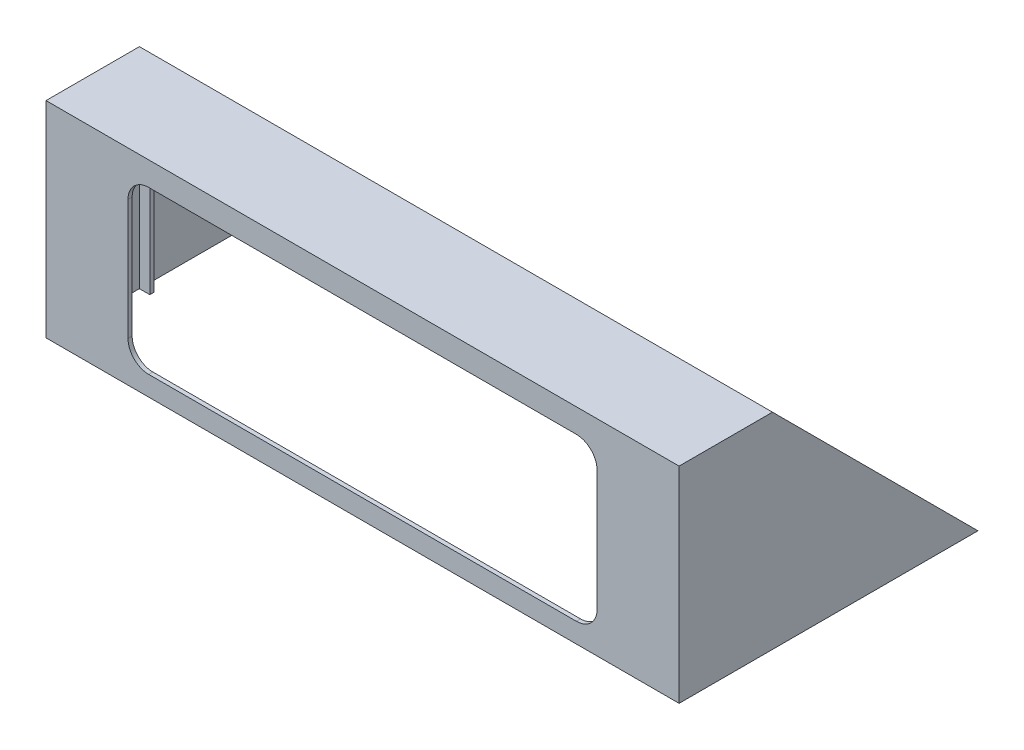
ISO-10303-21;
HEADER;
FILE_DESCRIPTION(('STEP AP214'),'2;1');
FILE_NAME('part.step','',(''),(''),'','','');
FILE_SCHEMA(('AUTOMOTIVE_DESIGN { 1 0 10303 214 1 1 1 1 }'));
ENDSEC;
DATA;
#1=APPLICATION_CONTEXT('core data for automotive mechanical design processes');
#2=APPLICATION_PROTOCOL_DEFINITION('international standard','automotive_design',2000,#1);
#3=PRODUCT_CONTEXT('',#1,'mechanical');
#4=PRODUCT('Part','Part','',(#3));
#5=PRODUCT_RELATED_PRODUCT_CATEGORY('part','',(#4));
#6=PRODUCT_DEFINITION_FORMATION('','',#4);
#7=PRODUCT_DEFINITION_CONTEXT('part definition',#1,'design');
#8=PRODUCT_DEFINITION('design','',#6,#7);
#9=PRODUCT_DEFINITION_SHAPE('','',#8);
#10=(LENGTH_UNIT() NAMED_UNIT(*) SI_UNIT(.MILLI.,.METRE.));
#11=(NAMED_UNIT(*) PLANE_ANGLE_UNIT() SI_UNIT($,.RADIAN.));
#12=(NAMED_UNIT(*) SI_UNIT($,.STERADIAN.) SOLID_ANGLE_UNIT());
#13=UNCERTAINTY_MEASURE_WITH_UNIT(LENGTH_MEASURE(1.E-05),#10,'distance_accuracy_value','');
#14=(GEOMETRIC_REPRESENTATION_CONTEXT(3) GLOBAL_UNCERTAINTY_ASSIGNED_CONTEXT((#13)) GLOBAL_UNIT_ASSIGNED_CONTEXT((#10,
#11,#12)) REPRESENTATION_CONTEXT('',''));
#15=CARTESIAN_POINT('',(0.,0.,0.));
#16=DIRECTION('',(0.,0.,1.));
#17=DIRECTION('',(1.,0.,0.));
#18=AXIS2_PLACEMENT_3D('',#15,#16,#17);
#19=CARTESIAN_POINT('',(0.,0.,-10.25));
#20=DIRECTION('',(0.,0.,1.));
#21=DIRECTION('',(1.,0.,0.));
#22=AXIS2_PLACEMENT_3D('',#19,#20,#21);
#23=PLANE('',#22);
#24=DIRECTION('',(0.,1.,0.));
#25=VECTOR('',#24,1.);
#26=CARTESIAN_POINT('',(-72.75,-24.25,-10.25));
#27=LINE('',#26,#25);
#28=CARTESIAN_POINT('',(-72.75,-24.25,-10.25));
#29=VERTEX_POINT('',#28);
#30=CARTESIAN_POINT('',(-72.75,24.25,-10.25));
#31=VERTEX_POINT('',#30);
#32=EDGE_CURVE('E375',#29,#31,#27,.T.);
#33=ORIENTED_EDGE('',*,*,#32,.T.);
#34=DIRECTION('',(-1.,0.,0.));
#35=VECTOR('',#34,1.);
#36=CARTESIAN_POINT('',(75.25,24.25,-10.25));
#37=LINE('',#36,#35);
#38=CARTESIAN_POINT('',(-75.25,24.25,-10.25));
#39=VERTEX_POINT('',#38);
#40=EDGE_CURVE('E417',#31,#39,#37,.T.);
#41=ORIENTED_EDGE('',*,*,#40,.T.);
#42=DIRECTION('',(0.,-1.,0.));
#43=VECTOR('',#42,1.);
#44=CARTESIAN_POINT('',(-75.25,-24.25,-10.25));
#45=LINE('',#44,#43);
#46=CARTESIAN_POINT('',(-75.25,-24.25,-10.25));
#47=VERTEX_POINT('',#46);
#48=EDGE_CURVE('E390',#39,#47,#45,.T.);
#49=ORIENTED_EDGE('',*,*,#48,.T.);
#50=DIRECTION('',(1.,0.,0.));
#51=VECTOR('',#50,1.);
#52=CARTESIAN_POINT('',(75.25,-24.25,-10.25));
#53=LINE('',#52,#51);
#54=EDGE_CURVE('E410',#47,#29,#53,.T.);
#55=ORIENTED_EDGE('',*,*,#54,.T.);
#56=EDGE_LOOP('',(#33,#41,#49,#55));
#57=FACE_BOUND('',#56,.T.);
#58=ADVANCED_FACE('F39',(#57),#23,.T.);
#59=CARTESIAN_POINT('',(75.25,-24.25,10.25));
#60=DIRECTION('',(0.,1.,0.));
#61=DIRECTION('',(-1.,0.,0.));
#62=AXIS2_PLACEMENT_3D('',#59,#60,#61);
#63=PLANE('',#62);
#64=DIRECTION('',(0.,0.,-1.));
#65=VECTOR('',#64,1.);
#66=CARTESIAN_POINT('',(-76.25,-24.25,10.25));
#67=LINE('',#66,#65);
#68=CARTESIAN_POINT('',(-76.25,-24.25,11.25));
#69=VERTEX_POINT('',#68);
#70=CARTESIAN_POINT('',(-76.25,-24.25,-60.7500000000006));
#71=VERTEX_POINT('',#70);
#72=EDGE_CURVE('E11',#69,#71,#67,.T.);
#73=ORIENTED_EDGE('',*,*,#72,.T.);
#74=DIRECTION('',(-1.,0.,0.));
#75=VECTOR('',#74,1.);
#76=CARTESIAN_POINT('',(-75.25,-24.25,-60.7500000000006));
#77=LINE('',#76,#75);
#78=CARTESIAN_POINT('',(-75.25,-24.25,-60.7500000000006));
#79=VERTEX_POINT('',#78);
#80=EDGE_CURVE('E211',#79,#71,#77,.T.);
#81=ORIENTED_EDGE('',*,*,#80,.F.);
#82=DIRECTION('',(0.,0.,1.));
#83=VECTOR('',#82,1.);
#84=CARTESIAN_POINT('',(-75.25,-24.25,-60.7500000000006));
#85=LINE('',#84,#83);
#86=CARTESIAN_POINT('',(-75.25,-24.25,-11.25));
#87=VERTEX_POINT('',#86);
#88=EDGE_CURVE('E212',#79,#87,#85,.T.);
#89=ORIENTED_EDGE('',*,*,#88,.T.);
#90=DIRECTION('',(1.,0.,0.));
#91=VECTOR('',#90,1.);
#92=CARTESIAN_POINT('',(75.25,-24.25,-11.25));
#93=LINE('',#92,#91);
#94=CARTESIAN_POINT('',(-72.75,-24.25,-11.25));
#95=VERTEX_POINT('',#94);
#96=EDGE_CURVE('E227',#87,#95,#93,.T.);
#97=ORIENTED_EDGE('',*,*,#96,.T.);
#98=DIRECTION('',(0.,0.,-1.));
#99=VECTOR('',#98,1.);
#100=CARTESIAN_POINT('',(-72.75,-24.25,143.120466518166));
#101=LINE('',#100,#99);
#102=EDGE_CURVE('E362',#29,#95,#101,.T.);
#103=ORIENTED_EDGE('',*,*,#102,.F.);
#104=ORIENTED_EDGE('',*,*,#54,.F.);
#105=DIRECTION('',(0.,0.,-1.));
#106=VECTOR('',#105,1.);
#107=CARTESIAN_POINT('',(-75.25,-24.25,10.25));
#108=LINE('',#107,#106);
#109=CARTESIAN_POINT('',(-75.25,-24.25,10.25));
#110=VERTEX_POINT('',#109);
#111=EDGE_CURVE('E432',#110,#47,#108,.T.);
#112=ORIENTED_EDGE('',*,*,#111,.F.);
#113=DIRECTION('',(1.,0.,0.));
#114=VECTOR('',#113,1.);
#115=CARTESIAN_POINT('',(75.25,-24.25,10.25));
#116=LINE('',#115,#114);
#117=CARTESIAN_POINT('',(75.25,-24.25,10.25));
#118=VERTEX_POINT('',#117);
#119=EDGE_CURVE('E394',#110,#118,#116,.T.);
#120=ORIENTED_EDGE('',*,*,#119,.T.);
#121=DIRECTION('',(0.,0.,-1.));
#122=VECTOR('',#121,1.);
#123=CARTESIAN_POINT('',(75.25,-24.25,10.25));
#124=LINE('',#123,#122);
#125=CARTESIAN_POINT('',(75.25,-24.25,-10.25));
#126=VERTEX_POINT('',#125);
#127=EDGE_CURVE('E428',#118,#126,#124,.T.);
#128=ORIENTED_EDGE('',*,*,#127,.T.);
#129=CARTESIAN_POINT('',(72.75,-24.25,-10.25));
#130=VERTEX_POINT('',#129);
#131=EDGE_CURVE('E409',#130,#126,#53,.T.);
#132=ORIENTED_EDGE('',*,*,#131,.F.);
#133=DIRECTION('',(0.,0.,-1.));
#134=VECTOR('',#133,1.);
#135=CARTESIAN_POINT('',(72.75,-24.25,143.120466518166));
#136=LINE('',#135,#134);
#137=CARTESIAN_POINT('',(72.75,-24.25,-11.25));
#138=VERTEX_POINT('',#137);
#139=EDGE_CURVE('E373',#130,#138,#136,.T.);
#140=ORIENTED_EDGE('',*,*,#139,.T.);
#141=CARTESIAN_POINT('',(75.25,-24.25,-11.25));
#142=VERTEX_POINT('',#141);
#143=EDGE_CURVE('E238',#138,#142,#93,.T.);
#144=ORIENTED_EDGE('',*,*,#143,.T.);
#145=DIRECTION('',(0.,0.,1.));
#146=VECTOR('',#145,1.);
#147=CARTESIAN_POINT('',(75.25,-24.25,-60.7500000000006));
#148=LINE('',#147,#146);
#149=CARTESIAN_POINT('',(75.25,-24.25,-60.7500000000006));
#150=VERTEX_POINT('',#149);
#151=EDGE_CURVE('E57',#150,#142,#148,.T.);
#152=ORIENTED_EDGE('',*,*,#151,.F.);
#153=DIRECTION('',(1.,0.,0.));
#154=VECTOR('',#153,1.);
#155=CARTESIAN_POINT('',(75.25,-24.25,-60.7500000000006));
#156=LINE('',#155,#154);
#157=CARTESIAN_POINT('',(76.25,-24.25,-60.7500000000006));
#158=VERTEX_POINT('',#157);
#159=EDGE_CURVE('E266',#150,#158,#156,.T.);
#160=ORIENTED_EDGE('',*,*,#159,.T.);
#161=DIRECTION('',(0.,0.,-1.));
#162=VECTOR('',#161,1.);
#163=CARTESIAN_POINT('',(76.25,-24.25,10.25));
#164=LINE('',#163,#162);
#165=CARTESIAN_POINT('',(76.25,-24.25,11.25));
#166=VERTEX_POINT('',#165);
#167=EDGE_CURVE('E49',#166,#158,#164,.T.);
#168=ORIENTED_EDGE('',*,*,#167,.F.);
#169=DIRECTION('',(1.,0.,0.));
#170=VECTOR('',#169,1.);
#171=CARTESIAN_POINT('',(75.25,-24.25,11.25));
#172=LINE('',#171,#170);
#173=EDGE_CURVE('E43',#69,#166,#172,.T.);
#174=ORIENTED_EDGE('',*,*,#173,.F.);
#175=EDGE_LOOP('',(#73,#81,#89,#97,#103,#104,#112,#120,#128,#132,#140,#144,#152,#160,#168,#174));
#176=FACE_BOUND('',#175,.T.);
#177=ADVANCED_FACE('F270',(#176),#63,.F.);
#178=CARTESIAN_POINT('',(-76.25,-24.25,10.25));
#179=DIRECTION('',(1.,0.,0.));
#180=DIRECTION('',(0.,0.,-1.));
#181=AXIS2_PLACEMENT_3D('',#178,#179,#180);
#182=PLANE('',#181);
#183=DIRECTION('',(0.,0.,-1.));
#184=VECTOR('',#183,1.);
#185=CARTESIAN_POINT('',(-76.25,25.25,10.25));
#186=LINE('',#185,#184);
#187=CARTESIAN_POINT('',(-76.25,25.25,11.25));
#188=VERTEX_POINT('',#187);
#189=CARTESIAN_POINT('',(-76.25,25.25,-11.25));
#190=VERTEX_POINT('',#189);
#191=EDGE_CURVE('E242',#188,#190,#186,.T.);
#192=ORIENTED_EDGE('',*,*,#191,.T.);
#193=DIRECTION('',(0.,-0.707106781186543,-0.707106781186551));
#194=VECTOR('',#193,1.);
#195=CARTESIAN_POINT('',(-76.25,25.25,-11.25));
#196=LINE('',#195,#194);
#197=EDGE_CURVE('E205',#190,#71,#196,.T.);
#198=ORIENTED_EDGE('',*,*,#197,.T.);
#199=ORIENTED_EDGE('',*,*,#72,.F.);
#200=DIRECTION('',(0.,-1.,0.));
#201=VECTOR('',#200,1.);
#202=CARTESIAN_POINT('',(-76.25,-24.25,11.25));
#203=LINE('',#202,#201);
#204=EDGE_CURVE('E237',#188,#69,#203,.T.);
#205=ORIENTED_EDGE('',*,*,#204,.F.);
#206=EDGE_LOOP('',(#192,#198,#199,#205));
#207=FACE_BOUND('',#206,.T.);
#208=ADVANCED_FACE('F444',(#207),#182,.F.);
#209=CARTESIAN_POINT('',(76.25,-24.25,10.25));
#210=DIRECTION('',(-1.,0.,0.));
#211=DIRECTION('',(0.,0.,1.));
#212=AXIS2_PLACEMENT_3D('',#209,#210,#211);
#213=PLANE('',#212);
#214=ORIENTED_EDGE('',*,*,#167,.T.);
#215=DIRECTION('',(0.,-0.707106781186543,-0.707106781186551));
#216=VECTOR('',#215,1.);
#217=CARTESIAN_POINT('',(76.25,25.25,-11.25));
#218=LINE('',#217,#216);
#219=CARTESIAN_POINT('',(76.25,25.25,-11.25));
#220=VERTEX_POINT('',#219);
#221=EDGE_CURVE('E260',#220,#158,#218,.T.);
#222=ORIENTED_EDGE('',*,*,#221,.F.);
#223=DIRECTION('',(0.,0.,-1.));
#224=VECTOR('',#223,1.);
#225=CARTESIAN_POINT('',(76.25,25.25,10.25));
#226=LINE('',#225,#224);
#227=CARTESIAN_POINT('',(76.25,25.25,11.25));
#228=VERTEX_POINT('',#227);
#229=EDGE_CURVE('E248',#228,#220,#226,.T.);
#230=ORIENTED_EDGE('',*,*,#229,.F.);
#231=DIRECTION('',(0.,1.,0.));
#232=VECTOR('',#231,1.);
#233=CARTESIAN_POINT('',(76.25,-24.25,11.25));
#234=LINE('',#233,#232);
#235=EDGE_CURVE('E247',#166,#228,#234,.T.);
#236=ORIENTED_EDGE('',*,*,#235,.F.);
#237=EDGE_LOOP('',(#214,#222,#230,#236));
#238=FACE_BOUND('',#237,.T.);
#239=ADVANCED_FACE('F258',(#238),#213,.F.);
#240=CARTESIAN_POINT('',(75.25,25.25,10.25));
#241=DIRECTION('',(0.,-1.,0.));
#242=DIRECTION('',(1.,0.,0.));
#243=AXIS2_PLACEMENT_3D('',#240,#241,#242);
#244=PLANE('',#243);
#245=DIRECTION('',(-1.,0.,0.));
#246=VECTOR('',#245,1.);
#247=CARTESIAN_POINT('',(75.25,25.25,-11.25));
#248=LINE('',#247,#246);
#249=CARTESIAN_POINT('',(75.25,25.25,-11.25));
#250=VERTEX_POINT('',#249);
#251=EDGE_CURVE('E232',#220,#250,#248,.T.);
#252=ORIENTED_EDGE('',*,*,#251,.T.);
#253=CARTESIAN_POINT('',(-75.25,25.25,-11.25));
#254=VERTEX_POINT('',#253);
#255=EDGE_CURVE('E224',#250,#254,#248,.T.);
#256=ORIENTED_EDGE('',*,*,#255,.T.);
#257=DIRECTION('',(-1.,0.,0.));
#258=VECTOR('',#257,1.);
#259=CARTESIAN_POINT('',(-75.25,25.25,-11.25));
#260=LINE('',#259,#258);
#261=EDGE_CURVE('E198',#254,#190,#260,.T.);
#262=ORIENTED_EDGE('',*,*,#261,.T.);
#263=ORIENTED_EDGE('',*,*,#191,.F.);
#264=DIRECTION('',(-1.,0.,0.));
#265=VECTOR('',#264,1.);
#266=CARTESIAN_POINT('',(75.25,25.25,11.25));
#267=LINE('',#266,#265);
#268=EDGE_CURVE('E244',#228,#188,#267,.T.);
#269=ORIENTED_EDGE('',*,*,#268,.F.);
#270=ORIENTED_EDGE('',*,*,#229,.T.);
#271=EDGE_LOOP('',(#252,#256,#262,#263,#269,#270));
#272=FACE_BOUND('',#271,.T.);
#273=ADVANCED_FACE('F230',(#272),#244,.F.);
#274=CARTESIAN_POINT('',(0.,0.,11.25));
#275=DIRECTION('',(0.,0.,1.));
#276=DIRECTION('',(1.,0.,0.));
#277=AXIS2_PLACEMENT_3D('',#274,#275,#276);
#278=PLANE('',#277);
#279=CARTESIAN_POINT('',(51.5,-14.5,11.25));
#280=DIRECTION('',(0.,0.,1.));
#281=DIRECTION('',(1.,0.,0.));
#282=AXIS2_PLACEMENT_3D('',#279,#280,#281);
#283=CIRCLE('',#282,5.);
#284=CARTESIAN_POINT('',(51.5,-19.5,11.25));
#285=VERTEX_POINT('',#284);
#286=CARTESIAN_POINT('',(56.5,-14.5,11.25));
#287=VERTEX_POINT('',#286);
#288=EDGE_CURVE('E65',#285,#287,#283,.T.);
#289=ORIENTED_EDGE('',*,*,#288,.F.);
#290=DIRECTION('',(1.,0.,0.));
#291=VECTOR('',#290,1.);
#292=CARTESIAN_POINT('',(51.5,-19.5,11.25));
#293=LINE('',#292,#291);
#294=CARTESIAN_POINT('',(-51.5,-19.5,11.25));
#295=VERTEX_POINT('',#294);
#296=EDGE_CURVE('E328',#295,#285,#293,.T.);
#297=ORIENTED_EDGE('',*,*,#296,.F.);
#298=CARTESIAN_POINT('',(-51.5,-14.5,11.25));
#299=DIRECTION('',(0.,0.,1.));
#300=DIRECTION('',(-1.,0.,0.));
#301=AXIS2_PLACEMENT_3D('',#298,#299,#300);
#302=CIRCLE('',#301,5.);
#303=CARTESIAN_POINT('',(-56.5,-14.5,11.25));
#304=VERTEX_POINT('',#303);
#305=EDGE_CURVE('E324',#304,#295,#302,.T.);
#306=ORIENTED_EDGE('',*,*,#305,.F.);
#307=DIRECTION('',(0.,-1.,0.));
#308=VECTOR('',#307,1.);
#309=CARTESIAN_POINT('',(-56.5,-14.5,11.25));
#310=LINE('',#309,#308);
#311=CARTESIAN_POINT('',(-56.5,14.5,11.25));
#312=VERTEX_POINT('',#311);
#313=EDGE_CURVE('E320',#312,#304,#310,.T.);
#314=ORIENTED_EDGE('',*,*,#313,.F.);
#315=CARTESIAN_POINT('',(-51.5,14.5,11.25));
#316=DIRECTION('',(0.,0.,1.));
#317=DIRECTION('',(1.,0.,0.));
#318=AXIS2_PLACEMENT_3D('',#315,#316,#317);
#319=CIRCLE('',#318,5.);
#320=CARTESIAN_POINT('',(-51.5,19.5,11.25));
#321=VERTEX_POINT('',#320);
#322=EDGE_CURVE('E316',#321,#312,#319,.T.);
#323=ORIENTED_EDGE('',*,*,#322,.F.);
#324=DIRECTION('',(-1.,0.,0.));
#325=VECTOR('',#324,1.);
#326=CARTESIAN_POINT('',(51.5,19.5,11.25));
#327=LINE('',#326,#325);
#328=CARTESIAN_POINT('',(51.5,19.5,11.25));
#329=VERTEX_POINT('',#328);
#330=EDGE_CURVE('E312',#329,#321,#327,.T.);
#331=ORIENTED_EDGE('',*,*,#330,.F.);
#332=CARTESIAN_POINT('',(51.5,14.5,11.25));
#333=DIRECTION('',(0.,0.,1.));
#334=DIRECTION('',(1.,0.,0.));
#335=AXIS2_PLACEMENT_3D('',#332,#333,#334);
#336=CIRCLE('',#335,5.);
#337=CARTESIAN_POINT('',(56.5,14.5,11.25));
#338=VERTEX_POINT('',#337);
#339=EDGE_CURVE('E308',#338,#329,#336,.T.);
#340=ORIENTED_EDGE('',*,*,#339,.F.);
#341=DIRECTION('',(0.,1.,0.));
#342=VECTOR('',#341,1.);
#343=CARTESIAN_POINT('',(56.5,-14.5,11.25));
#344=LINE('',#343,#342);
#345=EDGE_CURVE('E277',#287,#338,#344,.T.);
#346=ORIENTED_EDGE('',*,*,#345,.F.);
#347=EDGE_LOOP('',(#289,#297,#306,#314,#323,#331,#340,#346));
#348=FACE_BOUND('',#347,.T.);
#349=ORIENTED_EDGE('',*,*,#204,.T.);
#350=ORIENTED_EDGE('',*,*,#173,.T.);
#351=ORIENTED_EDGE('',*,*,#235,.T.);
#352=ORIENTED_EDGE('',*,*,#268,.T.);
#353=EDGE_LOOP('',(#349,#350,#351,#352));
#354=FACE_BOUND('',#353,.T.);
#355=ADVANCED_FACE('F440',(#348,#354),#278,.T.);
#356=CARTESIAN_POINT('',(0.,0.,-11.25));
#357=DIRECTION('',(0.,0.,1.));
#358=DIRECTION('',(1.,0.,0.));
#359=AXIS2_PLACEMENT_3D('',#356,#357,#358);
#360=PLANE('',#359);
#361=ORIENTED_EDGE('',*,*,#96,.F.);
#362=DIRECTION('',(0.,-1.,0.));
#363=VECTOR('',#362,1.);
#364=CARTESIAN_POINT('',(-75.25,25.25,-11.25));
#365=LINE('',#364,#363);
#366=EDGE_CURVE('E217',#254,#87,#365,.T.);
#367=ORIENTED_EDGE('',*,*,#366,.F.);
#368=ORIENTED_EDGE('',*,*,#255,.F.);
#369=DIRECTION('',(0.,-1.,0.));
#370=VECTOR('',#369,1.);
#371=CARTESIAN_POINT('',(75.25,25.25,-11.25));
#372=LINE('',#371,#370);
#373=EDGE_CURVE('E268',#250,#142,#372,.T.);
#374=ORIENTED_EDGE('',*,*,#373,.T.);
#375=ORIENTED_EDGE('',*,*,#143,.F.);
#376=DIRECTION('',(0.,-1.,0.));
#377=VECTOR('',#376,1.);
#378=CARTESIAN_POINT('',(72.75,-24.25,-11.25));
#379=LINE('',#378,#377);
#380=CARTESIAN_POINT('',(72.75,24.25,-11.25));
#381=VERTEX_POINT('',#380);
#382=EDGE_CURVE('E357',#381,#138,#379,.T.);
#383=ORIENTED_EDGE('',*,*,#382,.F.);
#384=DIRECTION('',(1.,0.,0.));
#385=VECTOR('',#384,1.);
#386=CARTESIAN_POINT('',(72.75,24.25,-11.25));
#387=LINE('',#386,#385);
#388=CARTESIAN_POINT('',(-72.75,24.25,-11.25));
#389=VERTEX_POINT('',#388);
#390=EDGE_CURVE('E358',#389,#381,#387,.T.);
#391=ORIENTED_EDGE('',*,*,#390,.F.);
#392=DIRECTION('',(0.,1.,0.));
#393=VECTOR('',#392,1.);
#394=CARTESIAN_POINT('',(-72.75,-24.25,-11.25));
#395=LINE('',#394,#393);
#396=EDGE_CURVE('E363',#95,#389,#395,.T.);
#397=ORIENTED_EDGE('',*,*,#396,.F.);
#398=EDGE_LOOP('',(#361,#367,#368,#374,#375,#383,#391,#397));
#399=FACE_BOUND('',#398,.T.);
#400=ADVANCED_FACE('F41',(#399),#360,.F.);
#401=CARTESIAN_POINT('',(-75.25,-24.25,10.25));
#402=DIRECTION('',(1.,0.,0.));
#403=DIRECTION('',(0.,0.,-1.));
#404=AXIS2_PLACEMENT_3D('',#401,#402,#403);
#405=PLANE('',#404);
#406=ORIENTED_EDGE('',*,*,#48,.F.);
#407=DIRECTION('',(0.,0.,-1.));
#408=VECTOR('',#407,1.);
#409=CARTESIAN_POINT('',(-75.25,24.25,10.25));
#410=LINE('',#409,#408);
#411=CARTESIAN_POINT('',(-75.25,24.25,10.25));
#412=VERTEX_POINT('',#411);
#413=EDGE_CURVE('E405',#412,#39,#410,.T.);
#414=ORIENTED_EDGE('',*,*,#413,.F.);
#415=DIRECTION('',(0.,-1.,0.));
#416=VECTOR('',#415,1.);
#417=CARTESIAN_POINT('',(-75.25,-24.25,10.25));
#418=LINE('',#417,#416);
#419=EDGE_CURVE('E391',#412,#110,#418,.T.);
#420=ORIENTED_EDGE('',*,*,#419,.T.);
#421=ORIENTED_EDGE('',*,*,#111,.T.);
#422=EDGE_LOOP('',(#406,#414,#420,#421));
#423=FACE_BOUND('',#422,.T.);
#424=ADVANCED_FACE('F470',(#423),#405,.T.);
#425=CARTESIAN_POINT('',(75.25,-24.25,10.25));
#426=DIRECTION('',(-1.,0.,0.));
#427=DIRECTION('',(0.,0.,1.));
#428=AXIS2_PLACEMENT_3D('',#425,#426,#427);
#429=PLANE('',#428);
#430=DIRECTION('',(0.,1.,0.));
#431=VECTOR('',#430,1.);
#432=CARTESIAN_POINT('',(75.25,-24.25,-10.25));
#433=LINE('',#432,#431);
#434=CARTESIAN_POINT('',(75.25,24.25,-10.25));
#435=VERTEX_POINT('',#434);
#436=EDGE_CURVE('E414',#126,#435,#433,.T.);
#437=ORIENTED_EDGE('',*,*,#436,.F.);
#438=ORIENTED_EDGE('',*,*,#127,.F.);
#439=DIRECTION('',(0.,1.,0.));
#440=VECTOR('',#439,1.);
#441=CARTESIAN_POINT('',(75.25,-24.25,10.25));
#442=LINE('',#441,#440);
#443=CARTESIAN_POINT('',(75.25,24.25,10.25));
#444=VERTEX_POINT('',#443);
#445=EDGE_CURVE('E399',#118,#444,#442,.T.);
#446=ORIENTED_EDGE('',*,*,#445,.T.);
#447=DIRECTION('',(0.,0.,-1.));
#448=VECTOR('',#447,1.);
#449=CARTESIAN_POINT('',(75.25,24.25,10.25));
#450=LINE('',#449,#448);
#451=EDGE_CURVE('E424',#444,#435,#450,.T.);
#452=ORIENTED_EDGE('',*,*,#451,.T.);
#453=EDGE_LOOP('',(#437,#438,#446,#452));
#454=FACE_BOUND('',#453,.T.);
#455=ADVANCED_FACE('F480',(#454),#429,.T.);
#456=CARTESIAN_POINT('',(75.25,24.25,10.25));
#457=DIRECTION('',(0.,-1.,0.));
#458=DIRECTION('',(1.,0.,0.));
#459=AXIS2_PLACEMENT_3D('',#456,#457,#458);
#460=PLANE('',#459);
#461=CARTESIAN_POINT('',(72.75,24.25,-10.25));
#462=VERTEX_POINT('',#461);
#463=EDGE_CURVE('E395',#435,#462,#37,.T.);
#464=ORIENTED_EDGE('',*,*,#463,.F.);
#465=ORIENTED_EDGE('',*,*,#451,.F.);
#466=DIRECTION('',(-1.,0.,0.));
#467=VECTOR('',#466,1.);
#468=CARTESIAN_POINT('',(75.25,24.25,10.25));
#469=LINE('',#468,#467);
#470=EDGE_CURVE('E402',#444,#412,#469,.T.);
#471=ORIENTED_EDGE('',*,*,#470,.T.);
#472=ORIENTED_EDGE('',*,*,#413,.T.);
#473=ORIENTED_EDGE('',*,*,#40,.F.);
#474=DIRECTION('',(0.,0.,-1.));
#475=VECTOR('',#474,1.);
#476=CARTESIAN_POINT('',(-72.75,24.25,143.120466518166));
#477=LINE('',#476,#475);
#478=EDGE_CURVE('E379',#31,#389,#477,.T.);
#479=ORIENTED_EDGE('',*,*,#478,.T.);
#480=ORIENTED_EDGE('',*,*,#390,.T.);
#481=DIRECTION('',(0.,0.,-1.));
#482=VECTOR('',#481,1.);
#483=CARTESIAN_POINT('',(72.75,24.25,143.120466518166));
#484=LINE('',#483,#482);
#485=EDGE_CURVE('E374',#462,#381,#484,.T.);
#486=ORIENTED_EDGE('',*,*,#485,.F.);
#487=EDGE_LOOP('',(#464,#465,#471,#472,#473,#479,#480,#486));
#488=FACE_BOUND('',#487,.T.);
#489=ADVANCED_FACE('F463',(#488),#460,.T.);
#490=CARTESIAN_POINT('',(0.,0.,10.25));
#491=DIRECTION('',(0.,0.,1.));
#492=DIRECTION('',(1.,0.,0.));
#493=AXIS2_PLACEMENT_3D('',#490,#491,#492);
#494=PLANE('',#493);
#495=DIRECTION('',(-1.,0.,0.));
#496=VECTOR('',#495,1.);
#497=CARTESIAN_POINT('',(51.5,-19.5,10.25));
#498=LINE('',#497,#496);
#499=CARTESIAN_POINT('',(51.5,-19.5,10.25));
#500=VERTEX_POINT('',#499);
#501=CARTESIAN_POINT('',(-51.5,-19.5,10.25));
#502=VERTEX_POINT('',#501);
#503=EDGE_CURVE('E298',#500,#502,#498,.T.);
#504=ORIENTED_EDGE('',*,*,#503,.F.);
#505=CARTESIAN_POINT('',(51.5,-14.5,10.25));
#506=DIRECTION('',(0.,0.,1.));
#507=DIRECTION('',(1.,0.,0.));
#508=AXIS2_PLACEMENT_3D('',#505,#506,#507);
#509=CIRCLE('',#508,5.);
#510=CARTESIAN_POINT('',(56.5,-14.5,10.25));
#511=VERTEX_POINT('',#510);
#512=EDGE_CURVE('E301',#511,#500,#509,.F.);
#513=ORIENTED_EDGE('',*,*,#512,.F.);
#514=DIRECTION('',(0.,-1.,0.));
#515=VECTOR('',#514,1.);
#516=CARTESIAN_POINT('',(56.5,-14.5,10.25));
#517=LINE('',#516,#515);
#518=CARTESIAN_POINT('',(56.5,14.5,10.25));
#519=VERTEX_POINT('',#518);
#520=EDGE_CURVE('E303',#519,#511,#517,.T.);
#521=ORIENTED_EDGE('',*,*,#520,.F.);
#522=CARTESIAN_POINT('',(51.5,14.5,10.25));
#523=DIRECTION('',(0.,0.,1.));
#524=DIRECTION('',(1.,0.,0.));
#525=AXIS2_PLACEMENT_3D('',#522,#523,#524);
#526=CIRCLE('',#525,5.);
#527=CARTESIAN_POINT('',(51.5,19.5,10.25));
#528=VERTEX_POINT('',#527);
#529=EDGE_CURVE('E281',#528,#519,#526,.F.);
#530=ORIENTED_EDGE('',*,*,#529,.F.);
#531=DIRECTION('',(1.,0.,0.));
#532=VECTOR('',#531,1.);
#533=CARTESIAN_POINT('',(51.5,19.5,10.25));
#534=LINE('',#533,#532);
#535=CARTESIAN_POINT('',(-51.5,19.5,10.25));
#536=VERTEX_POINT('',#535);
#537=EDGE_CURVE('E285',#536,#528,#534,.T.);
#538=ORIENTED_EDGE('',*,*,#537,.F.);
#539=CARTESIAN_POINT('',(-51.5,14.5,10.25));
#540=DIRECTION('',(0.,0.,1.));
#541=DIRECTION('',(1.,0.,0.));
#542=AXIS2_PLACEMENT_3D('',#539,#540,#541);
#543=CIRCLE('',#542,5.);
#544=CARTESIAN_POINT('',(-56.5,14.5,10.25));
#545=VERTEX_POINT('',#544);
#546=EDGE_CURVE('E289',#545,#536,#543,.F.);
#547=ORIENTED_EDGE('',*,*,#546,.F.);
#548=DIRECTION('',(0.,1.,0.));
#549=VECTOR('',#548,1.);
#550=CARTESIAN_POINT('',(-56.5,-14.5,10.25));
#551=LINE('',#550,#549);
#552=CARTESIAN_POINT('',(-56.5,-14.5,10.25));
#553=VERTEX_POINT('',#552);
#554=EDGE_CURVE('E292',#553,#545,#551,.T.);
#555=ORIENTED_EDGE('',*,*,#554,.F.);
#556=CARTESIAN_POINT('',(-51.5,-14.5,10.25));
#557=DIRECTION('',(0.,0.,1.));
#558=DIRECTION('',(1.,0.,0.));
#559=AXIS2_PLACEMENT_3D('',#556,#557,#558);
#560=CIRCLE('',#559,5.);
#561=EDGE_CURVE('E295',#502,#553,#560,.F.);
#562=ORIENTED_EDGE('',*,*,#561,.F.);
#563=EDGE_LOOP('',(#504,#513,#521,#530,#538,#547,#555,#562));
#564=FACE_BOUND('',#563,.T.);
#565=ORIENTED_EDGE('',*,*,#419,.F.);
#566=ORIENTED_EDGE('',*,*,#470,.F.);
#567=ORIENTED_EDGE('',*,*,#445,.F.);
#568=ORIENTED_EDGE('',*,*,#119,.F.);
#569=EDGE_LOOP('',(#565,#566,#567,#568));
#570=FACE_BOUND('',#569,.T.);
#571=ADVANCED_FACE('F476',(#564,#570),#494,.F.);
#572=DIRECTION('',(0.,-1.,0.));
#573=VECTOR('',#572,1.);
#574=CARTESIAN_POINT('',(72.75,-24.25,-10.25));
#575=LINE('',#574,#573);
#576=EDGE_CURVE('E369',#462,#130,#575,.T.);
#577=ORIENTED_EDGE('',*,*,#576,.T.);
#578=ORIENTED_EDGE('',*,*,#131,.T.);
#579=ORIENTED_EDGE('',*,*,#436,.T.);
#580=ORIENTED_EDGE('',*,*,#463,.T.);
#581=EDGE_LOOP('',(#577,#578,#579,#580));
#582=FACE_BOUND('',#581,.T.);
#583=ADVANCED_FACE('F482',(#582),#23,.T.);
#584=CARTESIAN_POINT('',(-72.75,-24.25,143.120466518166));
#585=DIRECTION('',(-1.,0.,0.));
#586=DIRECTION('',(0.,0.,1.));
#587=AXIS2_PLACEMENT_3D('',#584,#585,#586);
#588=PLANE('',#587);
#589=ORIENTED_EDGE('',*,*,#102,.T.);
#590=ORIENTED_EDGE('',*,*,#396,.T.);
#591=ORIENTED_EDGE('',*,*,#478,.F.);
#592=ORIENTED_EDGE('',*,*,#32,.F.);
#593=EDGE_LOOP('',(#589,#590,#591,#592));
#594=FACE_BOUND('',#593,.T.);
#595=ADVANCED_FACE('F456',(#594),#588,.F.);
#596=CARTESIAN_POINT('',(72.75,-24.25,143.120466518166));
#597=DIRECTION('',(1.,0.,0.));
#598=DIRECTION('',(0.,0.,-1.));
#599=AXIS2_PLACEMENT_3D('',#596,#597,#598);
#600=PLANE('',#599);
#601=ORIENTED_EDGE('',*,*,#485,.T.);
#602=ORIENTED_EDGE('',*,*,#382,.T.);
#603=ORIENTED_EDGE('',*,*,#139,.F.);
#604=ORIENTED_EDGE('',*,*,#576,.F.);
#605=EDGE_LOOP('',(#601,#602,#603,#604));
#606=FACE_BOUND('',#605,.T.);
#607=ADVANCED_FACE('F510',(#606),#600,.F.);
#608=CARTESIAN_POINT('',(51.5,-14.5,-109.290788018149));
#609=DIRECTION('',(0.,0.,1.));
#610=DIRECTION('',(1.,0.,0.));
#611=AXIS2_PLACEMENT_3D('',#608,#609,#610);
#612=CYLINDRICAL_SURFACE('',#611,5.);
#613=ORIENTED_EDGE('',*,*,#512,.T.);
#614=DIRECTION('',(0.,0.,1.));
#615=VECTOR('',#614,1.);
#616=CARTESIAN_POINT('',(51.5,-19.5,-109.290788018149));
#617=LINE('',#616,#615);
#618=EDGE_CURVE('E286',#500,#285,#617,.T.);
#619=ORIENTED_EDGE('',*,*,#618,.T.);
#620=ORIENTED_EDGE('',*,*,#288,.T.);
#621=DIRECTION('',(0.,0.,1.));
#622=VECTOR('',#621,1.);
#623=CARTESIAN_POINT('',(56.5,-14.5,-109.290788018149));
#624=LINE('',#623,#622);
#625=EDGE_CURVE('E332',#511,#287,#624,.T.);
#626=ORIENTED_EDGE('',*,*,#625,.F.);
#627=EDGE_LOOP('',(#613,#619,#620,#626));
#628=FACE_BOUND('',#627,.T.);
#629=ADVANCED_FACE('F520',(#628),#612,.F.);
#630=CARTESIAN_POINT('',(51.5,-19.5,-109.290788018149));
#631=DIRECTION('',(0.,-1.,0.));
#632=DIRECTION('',(1.,0.,0.));
#633=AXIS2_PLACEMENT_3D('',#630,#631,#632);
#634=PLANE('',#633);
#635=ORIENTED_EDGE('',*,*,#503,.T.);
#636=DIRECTION('',(0.,0.,1.));
#637=VECTOR('',#636,1.);
#638=CARTESIAN_POINT('',(-51.5,-19.5,-109.290788018149));
#639=LINE('',#638,#637);
#640=EDGE_CURVE('E335',#502,#295,#639,.T.);
#641=ORIENTED_EDGE('',*,*,#640,.T.);
#642=ORIENTED_EDGE('',*,*,#296,.T.);
#643=ORIENTED_EDGE('',*,*,#618,.F.);
#644=EDGE_LOOP('',(#635,#641,#642,#643));
#645=FACE_BOUND('',#644,.T.);
#646=ADVANCED_FACE('F524',(#645),#634,.F.);
#647=CARTESIAN_POINT('',(-51.5,-14.5,-109.290788018149));
#648=DIRECTION('',(0.,0.,1.));
#649=DIRECTION('',(1.,0.,0.));
#650=AXIS2_PLACEMENT_3D('',#647,#648,#649);
#651=CYLINDRICAL_SURFACE('',#650,5.);
#652=ORIENTED_EDGE('',*,*,#561,.T.);
#653=DIRECTION('',(0.,0.,1.));
#654=VECTOR('',#653,1.);
#655=CARTESIAN_POINT('',(-56.5,-14.5,-109.290788018149));
#656=LINE('',#655,#654);
#657=EDGE_CURVE('E338',#553,#304,#656,.T.);
#658=ORIENTED_EDGE('',*,*,#657,.T.);
#659=ORIENTED_EDGE('',*,*,#305,.T.);
#660=ORIENTED_EDGE('',*,*,#640,.F.);
#661=EDGE_LOOP('',(#652,#658,#659,#660));
#662=FACE_BOUND('',#661,.T.);
#663=ADVANCED_FACE('F543',(#662),#651,.F.);
#664=CARTESIAN_POINT('',(-56.5,-14.5,-109.290788018149));
#665=DIRECTION('',(-1.,0.,0.));
#666=DIRECTION('',(0.,0.,1.));
#667=AXIS2_PLACEMENT_3D('',#664,#665,#666);
#668=PLANE('',#667);
#669=ORIENTED_EDGE('',*,*,#554,.T.);
#670=DIRECTION('',(0.,0.,1.));
#671=VECTOR('',#670,1.);
#672=CARTESIAN_POINT('',(-56.5,14.5,-109.290788018149));
#673=LINE('',#672,#671);
#674=EDGE_CURVE('E341',#545,#312,#673,.T.);
#675=ORIENTED_EDGE('',*,*,#674,.T.);
#676=ORIENTED_EDGE('',*,*,#313,.T.);
#677=ORIENTED_EDGE('',*,*,#657,.F.);
#678=EDGE_LOOP('',(#669,#675,#676,#677));
#679=FACE_BOUND('',#678,.T.);
#680=ADVANCED_FACE('F539',(#679),#668,.F.);
#681=CARTESIAN_POINT('',(-51.5,14.5,-109.290788018149));
#682=DIRECTION('',(0.,0.,1.));
#683=DIRECTION('',(1.,0.,0.));
#684=AXIS2_PLACEMENT_3D('',#681,#682,#683);
#685=CYLINDRICAL_SURFACE('',#684,5.);
#686=ORIENTED_EDGE('',*,*,#546,.T.);
#687=DIRECTION('',(0.,0.,1.));
#688=VECTOR('',#687,1.);
#689=CARTESIAN_POINT('',(-51.5,19.5,-109.290788018149));
#690=LINE('',#689,#688);
#691=EDGE_CURVE('E344',#536,#321,#690,.T.);
#692=ORIENTED_EDGE('',*,*,#691,.T.);
#693=ORIENTED_EDGE('',*,*,#322,.T.);
#694=ORIENTED_EDGE('',*,*,#674,.F.);
#695=EDGE_LOOP('',(#686,#692,#693,#694));
#696=FACE_BOUND('',#695,.T.);
#697=ADVANCED_FACE('F535',(#696),#685,.F.);
#698=CARTESIAN_POINT('',(51.5,19.5,-109.290788018149));
#699=DIRECTION('',(0.,1.,0.));
#700=DIRECTION('',(-1.,0.,0.));
#701=AXIS2_PLACEMENT_3D('',#698,#699,#700);
#702=PLANE('',#701);
#703=ORIENTED_EDGE('',*,*,#537,.T.);
#704=DIRECTION('',(0.,0.,1.));
#705=VECTOR('',#704,1.);
#706=CARTESIAN_POINT('',(51.5,19.5,-109.290788018149));
#707=LINE('',#706,#705);
#708=EDGE_CURVE('E347',#528,#329,#707,.T.);
#709=ORIENTED_EDGE('',*,*,#708,.T.);
#710=ORIENTED_EDGE('',*,*,#330,.T.);
#711=ORIENTED_EDGE('',*,*,#691,.F.);
#712=EDGE_LOOP('',(#703,#709,#710,#711));
#713=FACE_BOUND('',#712,.T.);
#714=ADVANCED_FACE('F531',(#713),#702,.F.);
#715=CARTESIAN_POINT('',(51.5,14.5,-109.290788018149));
#716=DIRECTION('',(0.,0.,1.));
#717=DIRECTION('',(1.,0.,0.));
#718=AXIS2_PLACEMENT_3D('',#715,#716,#717);
#719=CYLINDRICAL_SURFACE('',#718,5.);
#720=ORIENTED_EDGE('',*,*,#529,.T.);
#721=DIRECTION('',(0.,0.,1.));
#722=VECTOR('',#721,1.);
#723=CARTESIAN_POINT('',(56.5,14.5,-109.290788018149));
#724=LINE('',#723,#722);
#725=EDGE_CURVE('E350',#519,#338,#724,.T.);
#726=ORIENTED_EDGE('',*,*,#725,.T.);
#727=ORIENTED_EDGE('',*,*,#339,.T.);
#728=ORIENTED_EDGE('',*,*,#708,.F.);
#729=EDGE_LOOP('',(#720,#726,#727,#728));
#730=FACE_BOUND('',#729,.T.);
#731=ADVANCED_FACE('F527',(#730),#719,.F.);
#732=CARTESIAN_POINT('',(56.5,-14.5,-109.290788018149));
#733=DIRECTION('',(1.,0.,0.));
#734=DIRECTION('',(0.,0.,-1.));
#735=AXIS2_PLACEMENT_3D('',#732,#733,#734);
#736=PLANE('',#735);
#737=ORIENTED_EDGE('',*,*,#520,.T.);
#738=ORIENTED_EDGE('',*,*,#625,.T.);
#739=ORIENTED_EDGE('',*,*,#345,.T.);
#740=ORIENTED_EDGE('',*,*,#725,.F.);
#741=EDGE_LOOP('',(#737,#738,#739,#740));
#742=FACE_BOUND('',#741,.T.);
#743=ADVANCED_FACE('F495',(#742),#736,.F.);
#744=CARTESIAN_POINT('',(75.25,25.25,-11.25));
#745=DIRECTION('',(0.,-0.707106781186552,0.707106781186544));
#746=DIRECTION('',(0.,-0.707106781186544,-0.707106781186552));
#747=AXIS2_PLACEMENT_3D('',#744,#745,#746);
#748=PLANE('',#747);
#749=ORIENTED_EDGE('',*,*,#221,.T.);
#750=ORIENTED_EDGE('',*,*,#159,.F.);
#751=DIRECTION('',(0.,-0.707106781186543,-0.707106781186551));
#752=VECTOR('',#751,1.);
#753=CARTESIAN_POINT('',(75.25,25.25,-11.25));
#754=LINE('',#753,#752);
#755=EDGE_CURVE('E273',#250,#150,#754,.T.);
#756=ORIENTED_EDGE('',*,*,#755,.F.);
#757=ORIENTED_EDGE('',*,*,#251,.F.);
#758=EDGE_LOOP('',(#749,#750,#756,#757));
#759=FACE_BOUND('',#758,.T.);
#760=ADVANCED_FACE('F265',(#759),#748,.F.);
#761=CARTESIAN_POINT('',(75.25,0.,0.));
#762=DIRECTION('',(-1.,0.,0.));
#763=DIRECTION('',(0.,0.,1.));
#764=AXIS2_PLACEMENT_3D('',#761,#762,#763);
#765=PLANE('',#764);
#766=ORIENTED_EDGE('',*,*,#373,.F.);
#767=ORIENTED_EDGE('',*,*,#755,.T.);
#768=ORIENTED_EDGE('',*,*,#151,.T.);
#769=EDGE_LOOP('',(#766,#767,#768));
#770=FACE_BOUND('',#769,.T.);
#771=ADVANCED_FACE('F487',(#770),#765,.T.);
#772=CARTESIAN_POINT('',(-75.25,25.25,-11.25));
#773=DIRECTION('',(0.,0.707106781186552,-0.707106781186544));
#774=DIRECTION('',(0.,0.707106781186544,0.707106781186552));
#775=AXIS2_PLACEMENT_3D('',#772,#773,#774);
#776=PLANE('',#775);
#777=ORIENTED_EDGE('',*,*,#197,.F.);
#778=ORIENTED_EDGE('',*,*,#261,.F.);
#779=DIRECTION('',(0.,-0.707106781186543,-0.707106781186551));
#780=VECTOR('',#779,1.);
#781=CARTESIAN_POINT('',(-75.25,25.25,-11.25));
#782=LINE('',#781,#780);
#783=EDGE_CURVE('E202',#254,#79,#782,.T.);
#784=ORIENTED_EDGE('',*,*,#783,.T.);
#785=ORIENTED_EDGE('',*,*,#80,.T.);
#786=EDGE_LOOP('',(#777,#778,#784,#785));
#787=FACE_BOUND('',#786,.T.);
#788=ADVANCED_FACE('F200',(#787),#776,.T.);
#789=CARTESIAN_POINT('',(-75.25,0.,0.));
#790=DIRECTION('',(1.,0.,0.));
#791=DIRECTION('',(0.,0.,1.));
#792=AXIS2_PLACEMENT_3D('',#789,#790,#791);
#793=PLANE('',#792);
#794=ORIENTED_EDGE('',*,*,#366,.T.);
#795=ORIENTED_EDGE('',*,*,#88,.F.);
#796=ORIENTED_EDGE('',*,*,#783,.F.);
#797=EDGE_LOOP('',(#794,#795,#796));
#798=FACE_BOUND('',#797,.T.);
#799=ADVANCED_FACE('F216',(#798),#793,.T.);
#800=CLOSED_SHELL('',(#58,#177,#208,#239,#273,#355,#400,#424,#455,#489,#571,#583,#595,#607,#629,
#646,#663,#680,#697,#714,#731,#743,#760,#771,#788,#799));
#801=MANIFOLD_SOLID_BREP('B2',#800);
#802=ADVANCED_BREP_SHAPE_REPRESENTATION('',(#18,#801),#14);
#803=SHAPE_DEFINITION_REPRESENTATION(#9,#802);
ENDSEC;
END-ISO-10303-21;
